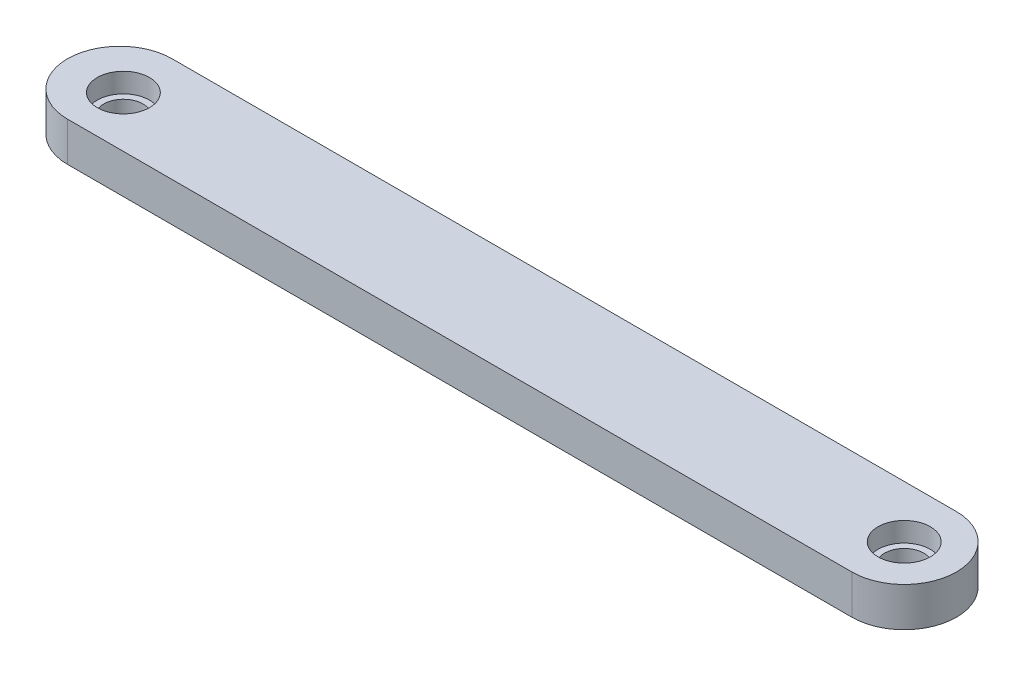
ISO-10303-21;
HEADER;
FILE_DESCRIPTION(('STEP AP214'),'2;1');
FILE_NAME('part.step','',(''),(''),'','','');
FILE_SCHEMA(('AUTOMOTIVE_DESIGN { 1 0 10303 214 1 1 1 1 }'));
ENDSEC;
DATA;
#1=APPLICATION_CONTEXT('core data for automotive mechanical design processes');
#2=APPLICATION_PROTOCOL_DEFINITION('international standard','automotive_design',2000,#1);
#3=PRODUCT_CONTEXT('',#1,'mechanical');
#4=PRODUCT('Part','Part','',(#3));
#5=PRODUCT_RELATED_PRODUCT_CATEGORY('part','',(#4));
#6=PRODUCT_DEFINITION_FORMATION('','',#4);
#7=PRODUCT_DEFINITION_CONTEXT('part definition',#1,'design');
#8=PRODUCT_DEFINITION('design','',#6,#7);
#9=PRODUCT_DEFINITION_SHAPE('','',#8);
#10=(LENGTH_UNIT() NAMED_UNIT(*) SI_UNIT(.MILLI.,.METRE.));
#11=(NAMED_UNIT(*) PLANE_ANGLE_UNIT() SI_UNIT($,.RADIAN.));
#12=(NAMED_UNIT(*) SI_UNIT($,.STERADIAN.) SOLID_ANGLE_UNIT());
#13=UNCERTAINTY_MEASURE_WITH_UNIT(LENGTH_MEASURE(1.E-05),#10,'distance_accuracy_value','');
#14=(GEOMETRIC_REPRESENTATION_CONTEXT(3) GLOBAL_UNCERTAINTY_ASSIGNED_CONTEXT((#13)) GLOBAL_UNIT_ASSIGNED_CONTEXT((#10,
#11,#12)) REPRESENTATION_CONTEXT('',''));
#15=CARTESIAN_POINT('',(0.,0.,0.));
#16=DIRECTION('',(0.,0.,1.));
#17=DIRECTION('',(1.,0.,0.));
#18=AXIS2_PLACEMENT_3D('',#15,#16,#17);
#19=CARTESIAN_POINT('',(-59.243309236767,6.,0.211557175716284));
#20=DIRECTION('',(0.,-1.,0.));
#21=DIRECTION('',(0.,0.,-1.));
#22=AXIS2_PLACEMENT_3D('',#19,#20,#21);
#23=CYLINDRICAL_SURFACE('',#22,3.);
#24=CARTESIAN_POINT('',(-59.243309236767,0.,0.211557175716284));
#25=DIRECTION('',(0.,1.,0.));
#26=DIRECTION('',(0.,0.,1.));
#27=AXIS2_PLACEMENT_3D('',#24,#25,#26);
#28=CIRCLE('',#27,3.);
#29=CARTESIAN_POINT('',(-59.243309236767,0.,3.21155717571629));
#30=VERTEX_POINT('',#29);
#31=EDGE_CURVE('E115',#30,#30,#28,.T.);
#32=ORIENTED_EDGE('',*,*,#31,.F.);
#33=EDGE_LOOP('',(#32));
#34=FACE_BOUND('',#33,.T.);
#35=CARTESIAN_POINT('',(-59.243309236767,3.,0.211557175716284));
#36=DIRECTION('',(0.,1.,0.));
#37=DIRECTION('',(0.,0.,1.));
#38=AXIS2_PLACEMENT_3D('',#35,#36,#37);
#39=CIRCLE('',#38,3.);
#40=CARTESIAN_POINT('',(-59.243309236767,3.,3.21155717571629));
#41=VERTEX_POINT('',#40);
#42=EDGE_CURVE('E43',#41,#41,#39,.T.);
#43=ORIENTED_EDGE('',*,*,#42,.T.);
#44=EDGE_LOOP('',(#43));
#45=FACE_BOUND('',#44,.T.);
#46=ADVANCED_FACE('F39',(#34,#45),#23,.F.);
#47=CARTESIAN_POINT('',(60.,6.,0.));
#48=DIRECTION('',(0.,-1.,0.));
#49=DIRECTION('',(0.,0.,-1.));
#50=AXIS2_PLACEMENT_3D('',#47,#48,#49);
#51=CYLINDRICAL_SURFACE('',#50,3.00000000000001);
#52=CARTESIAN_POINT('',(60.,0.,0.));
#53=DIRECTION('',(0.,1.,0.));
#54=DIRECTION('',(0.,0.,1.));
#55=AXIS2_PLACEMENT_3D('',#52,#53,#54);
#56=CIRCLE('',#55,3.00000000000001);
#57=CARTESIAN_POINT('',(60.,0.,3.00000000000001));
#58=VERTEX_POINT('',#57);
#59=EDGE_CURVE('E134',#58,#58,#56,.T.);
#60=ORIENTED_EDGE('',*,*,#59,.F.);
#61=EDGE_LOOP('',(#60));
#62=FACE_BOUND('',#61,.T.);
#63=CARTESIAN_POINT('',(60.,3.,0.));
#64=DIRECTION('',(0.,1.,0.));
#65=DIRECTION('',(0.,0.,1.));
#66=AXIS2_PLACEMENT_3D('',#63,#64,#65);
#67=CIRCLE('',#66,3.00000000000001);
#68=CARTESIAN_POINT('',(60.,3.,3.00000000000001));
#69=VERTEX_POINT('',#68);
#70=EDGE_CURVE('E125',#69,#69,#67,.T.);
#71=ORIENTED_EDGE('',*,*,#70,.T.);
#72=EDGE_LOOP('',(#71));
#73=FACE_BOUND('',#72,.T.);
#74=ADVANCED_FACE('F165',(#62,#73),#51,.F.);
#75=CARTESIAN_POINT('',(60.,6.,0.));
#76=DIRECTION('',(0.,1.,0.));
#77=DIRECTION('',(0.,0.,1.));
#78=AXIS2_PLACEMENT_3D('',#75,#76,#77);
#79=PLANE('',#78);
#80=CARTESIAN_POINT('',(-59.243309236767,6.,0.211557175716284));
#81=DIRECTION('',(0.,1.,0.));
#82=DIRECTION('',(0.,0.,1.));
#83=AXIS2_PLACEMENT_3D('',#80,#81,#82);
#84=CIRCLE('',#83,4.);
#85=CARTESIAN_POINT('',(-59.243309236767,6.,4.21155717571628));
#86=VERTEX_POINT('',#85);
#87=EDGE_CURVE('E136',#86,#86,#84,.T.);
#88=ORIENTED_EDGE('',*,*,#87,.F.);
#89=EDGE_LOOP('',(#88));
#90=FACE_BOUND('',#89,.T.);
#91=CARTESIAN_POINT('',(60.,6.,0.));
#92=DIRECTION('',(0.,1.,0.));
#93=DIRECTION('',(0.,0.,1.));
#94=AXIS2_PLACEMENT_3D('',#91,#92,#93);
#95=CIRCLE('',#94,4.00000000000001);
#96=CARTESIAN_POINT('',(60.,6.,4.00000000000001));
#97=VERTEX_POINT('',#96);
#98=EDGE_CURVE('E148',#97,#97,#95,.T.);
#99=ORIENTED_EDGE('',*,*,#98,.F.);
#100=EDGE_LOOP('',(#99));
#101=FACE_BOUND('',#100,.T.);
#102=CARTESIAN_POINT('',(60.,6.,0.));
#103=DIRECTION('',(0.,1.,0.));
#104=DIRECTION('',(0.,0.,1.));
#105=AXIS2_PLACEMENT_3D('',#102,#103,#104);
#106=CIRCLE('',#105,8.);
#107=CARTESIAN_POINT('',(60.,6.,8.));
#108=VERTEX_POINT('',#107);
#109=CARTESIAN_POINT('',(60.,6.,-8.));
#110=VERTEX_POINT('',#109);
#111=EDGE_CURVE('E94',#108,#110,#106,.T.);
#112=ORIENTED_EDGE('',*,*,#111,.T.);
#113=DIRECTION('',(-1.,0.,0.));
#114=VECTOR('',#113,1.);
#115=CARTESIAN_POINT('',(-60.,6.,-8.));
#116=LINE('',#115,#114);
#117=CARTESIAN_POINT('',(-60.,6.,-8.));
#118=VERTEX_POINT('',#117);
#119=EDGE_CURVE('E89',#110,#118,#116,.T.);
#120=ORIENTED_EDGE('',*,*,#119,.T.);
#121=CARTESIAN_POINT('',(-60.,6.,0.));
#122=DIRECTION('',(0.,1.,0.));
#123=DIRECTION('',(0.,0.,1.));
#124=AXIS2_PLACEMENT_3D('',#121,#122,#123);
#125=CIRCLE('',#124,8.);
#126=CARTESIAN_POINT('',(-60.,6.,8.));
#127=VERTEX_POINT('',#126);
#128=EDGE_CURVE('E92',#118,#127,#125,.T.);
#129=ORIENTED_EDGE('',*,*,#128,.T.);
#130=DIRECTION('',(1.,0.,0.));
#131=VECTOR('',#130,1.);
#132=CARTESIAN_POINT('',(-60.,6.,8.));
#133=LINE('',#132,#131);
#134=EDGE_CURVE('E59',#127,#108,#133,.T.);
#135=ORIENTED_EDGE('',*,*,#134,.T.);
#136=EDGE_LOOP('',(#112,#120,#129,#135));
#137=FACE_BOUND('',#136,.T.);
#138=ADVANCED_FACE('F90',(#90,#101,#137),#79,.T.);
#139=CARTESIAN_POINT('',(60.,0.,0.));
#140=DIRECTION('',(0.,1.,0.));
#141=DIRECTION('',(0.,0.,1.));
#142=AXIS2_PLACEMENT_3D('',#139,#140,#141);
#143=PLANE('',#142);
#144=CARTESIAN_POINT('',(60.,0.,0.));
#145=DIRECTION('',(0.,1.,0.));
#146=DIRECTION('',(0.,0.,1.));
#147=AXIS2_PLACEMENT_3D('',#144,#145,#146);
#148=CIRCLE('',#147,8.);
#149=CARTESIAN_POINT('',(60.,0.,8.));
#150=VERTEX_POINT('',#149);
#151=CARTESIAN_POINT('',(60.,0.,-8.));
#152=VERTEX_POINT('',#151);
#153=EDGE_CURVE('E111',#150,#152,#148,.T.);
#154=ORIENTED_EDGE('',*,*,#153,.F.);
#155=DIRECTION('',(1.,0.,0.));
#156=VECTOR('',#155,1.);
#157=CARTESIAN_POINT('',(-60.,0.,8.));
#158=LINE('',#157,#156);
#159=CARTESIAN_POINT('',(-60.,0.,8.));
#160=VERTEX_POINT('',#159);
#161=EDGE_CURVE('E82',#160,#150,#158,.T.);
#162=ORIENTED_EDGE('',*,*,#161,.F.);
#163=CARTESIAN_POINT('',(-60.,0.,0.));
#164=DIRECTION('',(0.,1.,0.));
#165=DIRECTION('',(0.,0.,1.));
#166=AXIS2_PLACEMENT_3D('',#163,#164,#165);
#167=CIRCLE('',#166,8.);
#168=CARTESIAN_POINT('',(-60.,0.,-8.));
#169=VERTEX_POINT('',#168);
#170=EDGE_CURVE('E76',#169,#160,#167,.T.);
#171=ORIENTED_EDGE('',*,*,#170,.F.);
#172=DIRECTION('',(-1.,0.,0.));
#173=VECTOR('',#172,1.);
#174=CARTESIAN_POINT('',(-60.,0.,-8.));
#175=LINE('',#174,#173);
#176=EDGE_CURVE('E99',#152,#169,#175,.T.);
#177=ORIENTED_EDGE('',*,*,#176,.F.);
#178=EDGE_LOOP('',(#154,#162,#171,#177));
#179=FACE_BOUND('',#178,.T.);
#180=ORIENTED_EDGE('',*,*,#31,.T.);
#181=EDGE_LOOP('',(#180));
#182=FACE_BOUND('',#181,.T.);
#183=ORIENTED_EDGE('',*,*,#59,.T.);
#184=EDGE_LOOP('',(#183));
#185=FACE_BOUND('',#184,.T.);
#186=ADVANCED_FACE('F160',(#179,#182,#185),#143,.F.);
#187=CARTESIAN_POINT('',(60.,6.,0.));
#188=DIRECTION('',(0.,-1.,0.));
#189=DIRECTION('',(0.,0.,-1.));
#190=AXIS2_PLACEMENT_3D('',#187,#188,#189);
#191=CYLINDRICAL_SURFACE('',#190,8.);
#192=ORIENTED_EDGE('',*,*,#153,.T.);
#193=DIRECTION('',(0.,-1.,0.));
#194=VECTOR('',#193,1.);
#195=CARTESIAN_POINT('',(60.,6.,-8.));
#196=LINE('',#195,#194);
#197=EDGE_CURVE('E11',#110,#152,#196,.T.);
#198=ORIENTED_EDGE('',*,*,#197,.F.);
#199=ORIENTED_EDGE('',*,*,#111,.F.);
#200=DIRECTION('',(0.,-1.,0.));
#201=VECTOR('',#200,1.);
#202=CARTESIAN_POINT('',(60.,6.,8.));
#203=LINE('',#202,#201);
#204=EDGE_CURVE('E107',#108,#150,#203,.T.);
#205=ORIENTED_EDGE('',*,*,#204,.T.);
#206=EDGE_LOOP('',(#192,#198,#199,#205));
#207=FACE_BOUND('',#206,.T.);
#208=ADVANCED_FACE('F41',(#207),#191,.T.);
#209=CARTESIAN_POINT('',(-60.,6.,-8.));
#210=DIRECTION('',(0.,0.,1.));
#211=DIRECTION('',(1.,0.,0.));
#212=AXIS2_PLACEMENT_3D('',#209,#210,#211);
#213=PLANE('',#212);
#214=ORIENTED_EDGE('',*,*,#176,.T.);
#215=DIRECTION('',(0.,-1.,0.));
#216=VECTOR('',#215,1.);
#217=CARTESIAN_POINT('',(-60.,6.,-8.));
#218=LINE('',#217,#216);
#219=EDGE_CURVE('E50',#118,#169,#218,.T.);
#220=ORIENTED_EDGE('',*,*,#219,.F.);
#221=ORIENTED_EDGE('',*,*,#119,.F.);
#222=ORIENTED_EDGE('',*,*,#197,.T.);
#223=EDGE_LOOP('',(#214,#220,#221,#222));
#224=FACE_BOUND('',#223,.T.);
#225=ADVANCED_FACE('F98',(#224),#213,.F.);
#226=CARTESIAN_POINT('',(-60.,6.,0.));
#227=DIRECTION('',(0.,-1.,0.));
#228=DIRECTION('',(0.,0.,-1.));
#229=AXIS2_PLACEMENT_3D('',#226,#227,#228);
#230=CYLINDRICAL_SURFACE('',#229,8.);
#231=ORIENTED_EDGE('',*,*,#170,.T.);
#232=DIRECTION('',(0.,-1.,0.));
#233=VECTOR('',#232,1.);
#234=CARTESIAN_POINT('',(-60.,6.,8.));
#235=LINE('',#234,#233);
#236=EDGE_CURVE('E101',#127,#160,#235,.T.);
#237=ORIENTED_EDGE('',*,*,#236,.F.);
#238=ORIENTED_EDGE('',*,*,#128,.F.);
#239=ORIENTED_EDGE('',*,*,#219,.T.);
#240=EDGE_LOOP('',(#231,#237,#238,#239));
#241=FACE_BOUND('',#240,.T.);
#242=ADVANCED_FACE('F103',(#241),#230,.T.);
#243=CARTESIAN_POINT('',(-60.,6.,8.));
#244=DIRECTION('',(0.,0.,-1.));
#245=DIRECTION('',(-1.,0.,0.));
#246=AXIS2_PLACEMENT_3D('',#243,#244,#245);
#247=PLANE('',#246);
#248=ORIENTED_EDGE('',*,*,#161,.T.);
#249=ORIENTED_EDGE('',*,*,#204,.F.);
#250=ORIENTED_EDGE('',*,*,#134,.F.);
#251=ORIENTED_EDGE('',*,*,#236,.T.);
#252=EDGE_LOOP('',(#248,#249,#250,#251));
#253=FACE_BOUND('',#252,.T.);
#254=ADVANCED_FACE('F186',(#253),#247,.F.);
#255=CARTESIAN_POINT('',(60.,3.,0.));
#256=DIRECTION('',(0.,1.,0.));
#257=DIRECTION('',(0.,0.,1.));
#258=AXIS2_PLACEMENT_3D('',#255,#256,#257);
#259=CYLINDRICAL_SURFACE('',#258,4.00000000000001);
#260=CARTESIAN_POINT('',(60.,3.,0.));
#261=DIRECTION('',(0.,1.,0.));
#262=DIRECTION('',(0.,0.,1.));
#263=AXIS2_PLACEMENT_3D('',#260,#261,#262);
#264=CIRCLE('',#263,4.00000000000001);
#265=CARTESIAN_POINT('',(60.,3.,4.00000000000001));
#266=VERTEX_POINT('',#265);
#267=EDGE_CURVE('E142',#266,#266,#264,.T.);
#268=ORIENTED_EDGE('',*,*,#267,.F.);
#269=EDGE_LOOP('',(#268));
#270=FACE_BOUND('',#269,.T.);
#271=ORIENTED_EDGE('',*,*,#98,.T.);
#272=EDGE_LOOP('',(#271));
#273=FACE_BOUND('',#272,.T.);
#274=ADVANCED_FACE('F182',(#270,#273),#259,.F.);
#275=CARTESIAN_POINT('',(60.,3.,0.));
#276=DIRECTION('',(0.,1.,0.));
#277=DIRECTION('',(0.,0.,1.));
#278=AXIS2_PLACEMENT_3D('',#275,#276,#277);
#279=PLANE('',#278);
#280=ORIENTED_EDGE('',*,*,#70,.F.);
#281=EDGE_LOOP('',(#280));
#282=FACE_BOUND('',#281,.T.);
#283=ORIENTED_EDGE('',*,*,#267,.T.);
#284=EDGE_LOOP('',(#283));
#285=FACE_BOUND('',#284,.T.);
#286=ADVANCED_FACE('F176',(#282,#285),#279,.T.);
#287=CARTESIAN_POINT('',(-59.243309236767,3.,0.211557175716284));
#288=DIRECTION('',(0.,1.,0.));
#289=DIRECTION('',(0.,0.,1.));
#290=AXIS2_PLACEMENT_3D('',#287,#288,#289);
#291=CYLINDRICAL_SURFACE('',#290,4.);
#292=CARTESIAN_POINT('',(-59.243309236767,3.,0.211557175716284));
#293=DIRECTION('',(0.,1.,0.));
#294=DIRECTION('',(0.,0.,1.));
#295=AXIS2_PLACEMENT_3D('',#292,#293,#294);
#296=CIRCLE('',#295,4.);
#297=CARTESIAN_POINT('',(-59.243309236767,3.,4.21155717571628));
#298=VERTEX_POINT('',#297);
#299=EDGE_CURVE('E128',#298,#298,#296,.T.);
#300=ORIENTED_EDGE('',*,*,#299,.F.);
#301=EDGE_LOOP('',(#300));
#302=FACE_BOUND('',#301,.T.);
#303=ORIENTED_EDGE('',*,*,#87,.T.);
#304=EDGE_LOOP('',(#303));
#305=FACE_BOUND('',#304,.T.);
#306=ADVANCED_FACE('F171',(#302,#305),#291,.F.);
#307=CARTESIAN_POINT('',(-59.243309236767,3.,0.211557175716284));
#308=DIRECTION('',(0.,1.,0.));
#309=DIRECTION('',(0.,0.,1.));
#310=AXIS2_PLACEMENT_3D('',#307,#308,#309);
#311=PLANE('',#310);
#312=ORIENTED_EDGE('',*,*,#42,.F.);
#313=EDGE_LOOP('',(#312));
#314=FACE_BOUND('',#313,.T.);
#315=ORIENTED_EDGE('',*,*,#299,.T.);
#316=EDGE_LOOP('',(#315));
#317=FACE_BOUND('',#316,.T.);
#318=ADVANCED_FACE('F169',(#314,#317),#311,.T.);
#319=CLOSED_SHELL('',(#46,#74,#138,#186,#208,#225,#242,#254,#274,#286,#306,#318));
#320=MANIFOLD_SOLID_BREP('B2',#319);
#321=ADVANCED_BREP_SHAPE_REPRESENTATION('',(#18,#320),#14);
#322=SHAPE_DEFINITION_REPRESENTATION(#9,#321);
ENDSEC;
END-ISO-10303-21;
